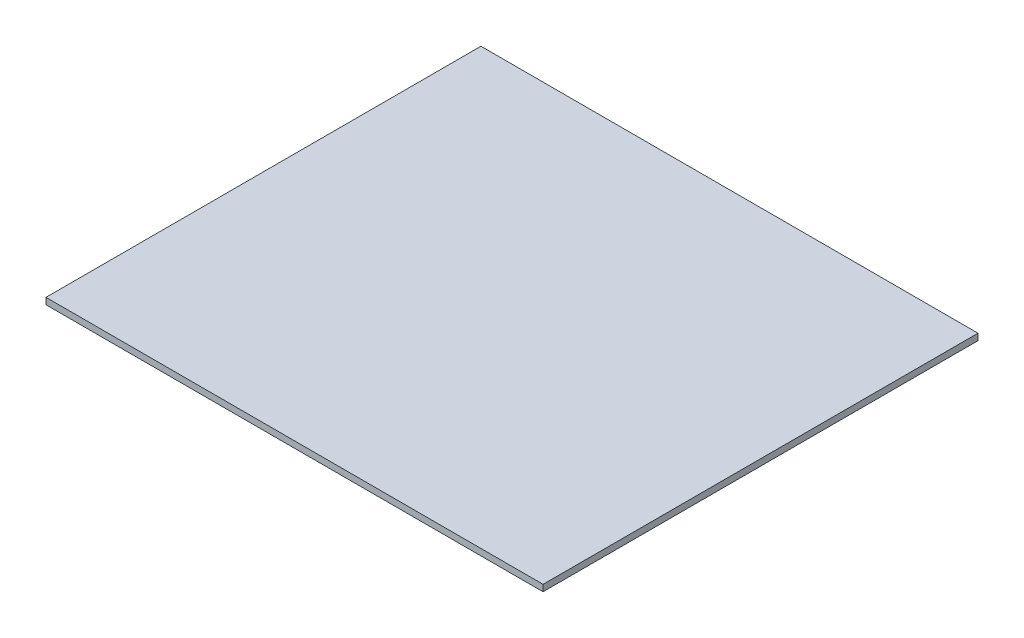
ISO-10303-21;
HEADER;
FILE_DESCRIPTION(('STEP AP214'),'2;1');
FILE_NAME('part.step','',(''),(''),'','','');
FILE_SCHEMA(('AUTOMOTIVE_DESIGN { 1 0 10303 214 1 1 1 1 }'));
ENDSEC;
DATA;
#1=APPLICATION_CONTEXT('core data for automotive mechanical design processes');
#2=APPLICATION_PROTOCOL_DEFINITION('international standard','automotive_design',2000,#1);
#3=PRODUCT_CONTEXT('',#1,'mechanical');
#4=PRODUCT('Part','Part','',(#3));
#5=PRODUCT_RELATED_PRODUCT_CATEGORY('part','',(#4));
#6=PRODUCT_DEFINITION_FORMATION('','',#4);
#7=PRODUCT_DEFINITION_CONTEXT('part definition',#1,'design');
#8=PRODUCT_DEFINITION('design','',#6,#7);
#9=PRODUCT_DEFINITION_SHAPE('','',#8);
#10=(LENGTH_UNIT() NAMED_UNIT(*) SI_UNIT(.MILLI.,.METRE.));
#11=(NAMED_UNIT(*) PLANE_ANGLE_UNIT() SI_UNIT($,.RADIAN.));
#12=(NAMED_UNIT(*) SI_UNIT($,.STERADIAN.) SOLID_ANGLE_UNIT());
#13=UNCERTAINTY_MEASURE_WITH_UNIT(LENGTH_MEASURE(1.E-05),#10,'distance_accuracy_value','');
#14=(GEOMETRIC_REPRESENTATION_CONTEXT(3) GLOBAL_UNCERTAINTY_ASSIGNED_CONTEXT((#13)) GLOBAL_UNIT_ASSIGNED_CONTEXT((#10,
#11,#12)) REPRESENTATION_CONTEXT('',''));
#15=CARTESIAN_POINT('',(0.,0.,0.));
#16=DIRECTION('',(0.,0.,1.));
#17=DIRECTION('',(1.,0.,0.));
#18=AXIS2_PLACEMENT_3D('',#15,#16,#17);
#19=CARTESIAN_POINT('',(-715.,10.4,375.));
#20=DIRECTION('',(1.,0.,0.));
#21=DIRECTION('',(0.,0.,-1.));
#22=AXIS2_PLACEMENT_3D('',#19,#20,#21);
#23=PLANE('',#22);
#24=DIRECTION('',(0.,1.,0.));
#25=VECTOR('',#24,1.);
#26=CARTESIAN_POINT('',(-715.,-189.6,-325.));
#27=LINE('',#26,#25);
#28=CARTESIAN_POINT('',(-715.,0.,-325.));
#29=VERTEX_POINT('',#28);
#30=CARTESIAN_POINT('',(-715.,10.4,-325.));
#31=VERTEX_POINT('',#30);
#32=EDGE_CURVE('E110',#29,#31,#27,.T.);
#33=ORIENTED_EDGE('',*,*,#32,.F.);
#34=DIRECTION('',(0.,0.,1.));
#35=VECTOR('',#34,1.);
#36=CARTESIAN_POINT('',(-715.,0.,375.));
#37=LINE('',#36,#35);
#38=CARTESIAN_POINT('',(-715.,0.,375.));
#39=VERTEX_POINT('',#38);
#40=EDGE_CURVE('E107',#29,#39,#37,.T.);
#41=ORIENTED_EDGE('',*,*,#40,.T.);
#42=DIRECTION('',(0.,-1.,0.));
#43=VECTOR('',#42,1.);
#44=CARTESIAN_POINT('',(-715.,10.4,375.));
#45=LINE('',#44,#43);
#46=CARTESIAN_POINT('',(-715.,10.4,375.));
#47=VERTEX_POINT('',#46);
#48=EDGE_CURVE('E100',#47,#39,#45,.T.);
#49=ORIENTED_EDGE('',*,*,#48,.F.);
#50=DIRECTION('',(0.,0.,1.));
#51=VECTOR('',#50,1.);
#52=CARTESIAN_POINT('',(-715.,10.4,375.));
#53=LINE('',#52,#51);
#54=EDGE_CURVE('E63',#31,#47,#53,.T.);
#55=ORIENTED_EDGE('',*,*,#54,.F.);
#56=EDGE_LOOP('',(#33,#41,#49,#55));
#57=FACE_BOUND('',#56,.T.);
#58=ADVANCED_FACE('F39',(#57),#23,.F.);
#59=CARTESIAN_POINT('',(-715.,10.4,375.));
#60=DIRECTION('',(0.,0.,-1.));
#61=DIRECTION('',(-1.,0.,0.));
#62=AXIS2_PLACEMENT_3D('',#59,#60,#61);
#63=PLANE('',#62);
#64=DIRECTION('',(0.,1.,0.));
#65=VECTOR('',#64,1.);
#66=CARTESIAN_POINT('',(85.,-189.6,375.));
#67=LINE('',#66,#65);
#68=CARTESIAN_POINT('',(85.,0.,375.));
#69=VERTEX_POINT('',#68);
#70=CARTESIAN_POINT('',(85.,10.4,375.));
#71=VERTEX_POINT('',#70);
#72=EDGE_CURVE('E54',#69,#71,#67,.T.);
#73=ORIENTED_EDGE('',*,*,#72,.T.);
#74=DIRECTION('',(1.,0.,0.));
#75=VECTOR('',#74,1.);
#76=CARTESIAN_POINT('',(-715.,10.4,375.));
#77=LINE('',#76,#75);
#78=EDGE_CURVE('E92',#47,#71,#77,.T.);
#79=ORIENTED_EDGE('',*,*,#78,.F.);
#80=ORIENTED_EDGE('',*,*,#48,.T.);
#81=DIRECTION('',(1.,0.,0.));
#82=VECTOR('',#81,1.);
#83=CARTESIAN_POINT('',(-715.,0.,375.));
#84=LINE('',#83,#82);
#85=EDGE_CURVE('E95',#39,#69,#84,.T.);
#86=ORIENTED_EDGE('',*,*,#85,.T.);
#87=EDGE_LOOP('',(#73,#79,#80,#86));
#88=FACE_BOUND('',#87,.T.);
#89=ADVANCED_FACE('F90',(#88),#63,.F.);
#90=CARTESIAN_POINT('',(0.,10.4,0.));
#91=DIRECTION('',(0.,-1.,0.));
#92=DIRECTION('',(0.,0.,-1.));
#93=AXIS2_PLACEMENT_3D('',#90,#91,#92);
#94=PLANE('',#93);
#95=DIRECTION('',(-1.,0.,0.));
#96=VECTOR('',#95,1.);
#97=CARTESIAN_POINT('',(-715.,10.4,-325.));
#98=LINE('',#97,#96);
#99=CARTESIAN_POINT('',(85.,10.4,-325.));
#100=VERTEX_POINT('',#99);
#101=EDGE_CURVE('E86',#100,#31,#98,.T.);
#102=ORIENTED_EDGE('',*,*,#101,.T.);
#103=ORIENTED_EDGE('',*,*,#54,.T.);
#104=ORIENTED_EDGE('',*,*,#78,.T.);
#105=DIRECTION('',(0.,0.,-1.));
#106=VECTOR('',#105,1.);
#107=CARTESIAN_POINT('',(85.,10.4,375.));
#108=LINE('',#107,#106);
#109=EDGE_CURVE('E80',#71,#100,#108,.T.);
#110=ORIENTED_EDGE('',*,*,#109,.T.);
#111=EDGE_LOOP('',(#102,#103,#104,#110));
#112=FACE_BOUND('',#111,.T.);
#113=ADVANCED_FACE('F98',(#112),#94,.F.);
#114=CARTESIAN_POINT('',(0.,0.,0.));
#115=DIRECTION('',(0.,-1.,0.));
#116=DIRECTION('',(0.,0.,-1.));
#117=AXIS2_PLACEMENT_3D('',#114,#115,#116);
#118=PLANE('',#117);
#119=ORIENTED_EDGE('',*,*,#40,.F.);
#120=DIRECTION('',(1.,0.,0.));
#121=VECTOR('',#120,1.);
#122=CARTESIAN_POINT('',(0.,0.,-325.));
#123=LINE('',#122,#121);
#124=CARTESIAN_POINT('',(85.,0.,-325.));
#125=VERTEX_POINT('',#124);
#126=EDGE_CURVE('E11',#29,#125,#123,.T.);
#127=ORIENTED_EDGE('',*,*,#126,.T.);
#128=DIRECTION('',(0.,0.,1.));
#129=VECTOR('',#128,1.);
#130=CARTESIAN_POINT('',(85.,0.,0.));
#131=LINE('',#130,#129);
#132=EDGE_CURVE('E47',#125,#69,#131,.T.);
#133=ORIENTED_EDGE('',*,*,#132,.T.);
#134=ORIENTED_EDGE('',*,*,#85,.F.);
#135=EDGE_LOOP('',(#119,#127,#133,#134));
#136=FACE_BOUND('',#135,.T.);
#137=ADVANCED_FACE('F115',(#136),#118,.T.);
#138=CARTESIAN_POINT('',(-715.,-189.6,-325.));
#139=DIRECTION('',(0.,0.,-1.));
#140=DIRECTION('',(-1.,0.,0.));
#141=AXIS2_PLACEMENT_3D('',#138,#139,#140);
#142=PLANE('',#141);
#143=ORIENTED_EDGE('',*,*,#32,.T.);
#144=ORIENTED_EDGE('',*,*,#101,.F.);
#145=DIRECTION('',(0.,1.,0.));
#146=VECTOR('',#145,1.);
#147=CARTESIAN_POINT('',(85.,-189.6,-325.));
#148=LINE('',#147,#146);
#149=EDGE_CURVE('E83',#125,#100,#148,.T.);
#150=ORIENTED_EDGE('',*,*,#149,.F.);
#151=ORIENTED_EDGE('',*,*,#126,.F.);
#152=EDGE_LOOP('',(#143,#144,#150,#151));
#153=FACE_BOUND('',#152,.T.);
#154=ADVANCED_FACE('F117',(#153),#142,.T.);
#155=CARTESIAN_POINT('',(85.,-189.6,375.));
#156=DIRECTION('',(1.,0.,0.));
#157=DIRECTION('',(0.,0.,-1.));
#158=AXIS2_PLACEMENT_3D('',#155,#156,#157);
#159=PLANE('',#158);
#160=ORIENTED_EDGE('',*,*,#149,.T.);
#161=ORIENTED_EDGE('',*,*,#109,.F.);
#162=ORIENTED_EDGE('',*,*,#72,.F.);
#163=ORIENTED_EDGE('',*,*,#132,.F.);
#164=EDGE_LOOP('',(#160,#161,#162,#163));
#165=FACE_BOUND('',#164,.T.);
#166=ADVANCED_FACE('F81',(#165),#159,.T.);
#167=CLOSED_SHELL('',(#58,#89,#113,#137,#154,#166));
#168=MANIFOLD_SOLID_BREP('B2',#167);
#169=ADVANCED_BREP_SHAPE_REPRESENTATION('',(#18,#168),#14);
#170=SHAPE_DEFINITION_REPRESENTATION(#9,#169);
ENDSEC;
END-ISO-10303-21;
